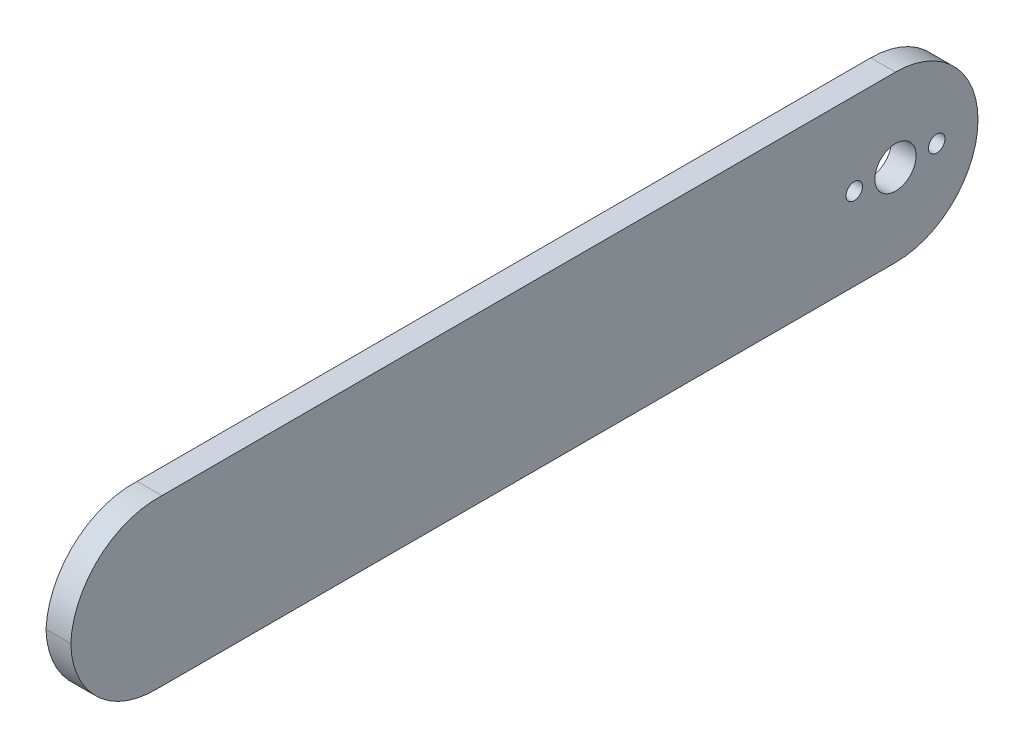
ISO-10303-21;
HEADER;
FILE_DESCRIPTION(('STEP AP214'),'2;1');
FILE_NAME('part.step','',(''),(''),'','','');
FILE_SCHEMA(('AUTOMOTIVE_DESIGN { 1 0 10303 214 1 1 1 1 }'));
ENDSEC;
DATA;
#1=APPLICATION_CONTEXT('core data for automotive mechanical design processes');
#2=APPLICATION_PROTOCOL_DEFINITION('international standard','automotive_design',2000,#1);
#3=PRODUCT_CONTEXT('',#1,'mechanical');
#4=PRODUCT('Part','Part','',(#3));
#5=PRODUCT_RELATED_PRODUCT_CATEGORY('part','',(#4));
#6=PRODUCT_DEFINITION_FORMATION('','',#4);
#7=PRODUCT_DEFINITION_CONTEXT('part definition',#1,'design');
#8=PRODUCT_DEFINITION('design','',#6,#7);
#9=PRODUCT_DEFINITION_SHAPE('','',#8);
#10=(LENGTH_UNIT() NAMED_UNIT(*) SI_UNIT(.MILLI.,.METRE.));
#11=(NAMED_UNIT(*) PLANE_ANGLE_UNIT() SI_UNIT($,.RADIAN.));
#12=(NAMED_UNIT(*) SI_UNIT($,.STERADIAN.) SOLID_ANGLE_UNIT());
#13=UNCERTAINTY_MEASURE_WITH_UNIT(LENGTH_MEASURE(1.E-05),#10,'distance_accuracy_value','');
#14=(GEOMETRIC_REPRESENTATION_CONTEXT(3) GLOBAL_UNCERTAINTY_ASSIGNED_CONTEXT((#13)) GLOBAL_UNIT_ASSIGNED_CONTEXT((#10,
#11,#12)) REPRESENTATION_CONTEXT('',''));
#15=CARTESIAN_POINT('',(0.,0.,0.));
#16=DIRECTION('',(0.,0.,1.));
#17=DIRECTION('',(1.,0.,0.));
#18=AXIS2_PLACEMENT_3D('',#15,#16,#17);
#19=CARTESIAN_POINT('',(3.,-0.696463854515231,82.1611103191617));
#20=DIRECTION('',(-1.,0.,0.));
#21=DIRECTION('',(0.,0.,1.));
#22=AXIS2_PLACEMENT_3D('',#19,#20,#21);
#23=PLANE('',#22);
#24=CARTESIAN_POINT('',(3.,-0.959595959595964,-12.5757575757576));
#25=DIRECTION('',(1.,0.,0.));
#26=DIRECTION('',(0.,0.,-1.));
#27=AXIS2_PLACEMENT_3D('',#24,#25,#26);
#28=CIRCLE('',#27,1.);
#29=CARTESIAN_POINT('',(3.,-0.959595959595964,-13.5757575757576));
#30=VERTEX_POINT('',#29);
#31=EDGE_CURVE('E169',#30,#30,#28,.T.);
#32=ORIENTED_EDGE('',*,*,#31,.F.);
#33=EDGE_LOOP('',(#32));
#34=FACE_BOUND('',#33,.T.);
#35=CARTESIAN_POINT('',(3.,-0.696463854515231,82.1611103191617));
#36=DIRECTION('',(1.,0.,0.));
#37=DIRECTION('',(0.,0.,1.));
#38=AXIS2_PLACEMENT_3D('',#35,#36,#37);
#39=CIRCLE('',#38,10.266504717335);
#40=CARTESIAN_POINT('',(3.,-0.959595959595963,92.4242424242424));
#41=VERTEX_POINT('',#40);
#42=CARTESIAN_POINT('',(3.,-10.959595959596,81.8979782140814));
#43=VERTEX_POINT('',#42);
#44=EDGE_CURVE('E117',#41,#43,#39,.T.);
#45=ORIENTED_EDGE('',*,*,#44,.T.);
#46=DIRECTION('',(0.,0.,-1.));
#47=VECTOR('',#46,1.);
#48=CARTESIAN_POINT('',(3.,-10.959595959596,81.8979782140814));
#49=LINE('',#48,#47);
#50=CARTESIAN_POINT('',(3.,-10.959595959596,-7.57575757575757));
#51=VERTEX_POINT('',#50);
#52=EDGE_CURVE('E84',#43,#51,#49,.T.);
#53=ORIENTED_EDGE('',*,*,#52,.T.);
#54=CARTESIAN_POINT('',(3.,-0.959595959595964,-7.57575757575757));
#55=DIRECTION('',(1.,0.,0.));
#56=DIRECTION('',(0.,0.,-1.));
#57=AXIS2_PLACEMENT_3D('',#54,#55,#56);
#58=CIRCLE('',#57,10.);
#59=CARTESIAN_POINT('',(3.,9.04040404040404,-7.5757575757575));
#60=VERTEX_POINT('',#59);
#61=EDGE_CURVE('E88',#51,#60,#58,.T.);
#62=ORIENTED_EDGE('',*,*,#61,.T.);
#63=DIRECTION('',(0.,0.,1.));
#64=VECTOR('',#63,1.);
#65=CARTESIAN_POINT('',(3.,9.04040404040404,81.3717140039203));
#66=LINE('',#65,#64);
#67=CARTESIAN_POINT('',(3.,9.04040404040404,81.3717140039203));
#68=VERTEX_POINT('',#67);
#69=EDGE_CURVE('E92',#60,#68,#66,.T.);
#70=ORIENTED_EDGE('',*,*,#69,.T.);
#71=CARTESIAN_POINT('',(3.,-1.485860169757,81.8979782140814));
#72=DIRECTION('',(1.,0.,0.));
#73=DIRECTION('',(0.,0.,1.));
#74=AXIS2_PLACEMENT_3D('',#71,#72,#73);
#75=CIRCLE('',#74,10.5394113801964);
#76=EDGE_CURVE('E50',#68,#41,#75,.T.);
#77=ORIENTED_EDGE('',*,*,#76,.T.);
#78=EDGE_LOOP('',(#45,#53,#62,#70,#77));
#79=FACE_BOUND('',#78,.T.);
#80=CARTESIAN_POINT('',(3.,-0.959595959595964,-7.57575757575757));
#81=DIRECTION('',(1.,0.,0.));
#82=DIRECTION('',(0.,0.,-1.));
#83=AXIS2_PLACEMENT_3D('',#80,#81,#82);
#84=CIRCLE('',#83,2.5);
#85=CARTESIAN_POINT('',(3.,-0.959595959595964,-10.0757575757576));
#86=VERTEX_POINT('',#85);
#87=EDGE_CURVE('E111',#86,#86,#84,.T.);
#88=ORIENTED_EDGE('',*,*,#87,.F.);
#89=EDGE_LOOP('',(#88));
#90=FACE_BOUND('',#89,.T.);
#91=CARTESIAN_POINT('',(3.,-0.959595959595964,-2.57575757575757));
#92=DIRECTION('',(1.,0.,0.));
#93=DIRECTION('',(0.,0.,-1.));
#94=AXIS2_PLACEMENT_3D('',#91,#92,#93);
#95=CIRCLE('',#94,1.);
#96=CARTESIAN_POINT('',(3.,-0.959595959595964,-3.57575757575757));
#97=VERTEX_POINT('',#96);
#98=EDGE_CURVE('E160',#97,#97,#95,.T.);
#99=ORIENTED_EDGE('',*,*,#98,.F.);
#100=EDGE_LOOP('',(#99));
#101=FACE_BOUND('',#100,.T.);
#102=ADVANCED_FACE('F33',(#34,#79,#90,#101),#23,.F.);
#103=CARTESIAN_POINT('',(0.,-0.696463854515231,82.1611103191617));
#104=DIRECTION('',(-1.,0.,0.));
#105=DIRECTION('',(0.,0.,1.));
#106=AXIS2_PLACEMENT_3D('',#103,#104,#105);
#107=PLANE('',#106);
#108=CARTESIAN_POINT('',(0.,-0.959595959595964,-12.5757575757576));
#109=DIRECTION('',(1.,0.,0.));
#110=DIRECTION('',(0.,0.,-1.));
#111=AXIS2_PLACEMENT_3D('',#108,#109,#110);
#112=CIRCLE('',#111,1.);
#113=CARTESIAN_POINT('',(0.,-0.959595959595964,-13.5757575757576));
#114=VERTEX_POINT('',#113);
#115=EDGE_CURVE('E166',#114,#114,#112,.T.);
#116=ORIENTED_EDGE('',*,*,#115,.T.);
#117=EDGE_LOOP('',(#116));
#118=FACE_BOUND('',#117,.T.);
#119=CARTESIAN_POINT('',(0.,-0.696463854515231,82.1611103191617));
#120=DIRECTION('',(1.,0.,0.));
#121=DIRECTION('',(0.,0.,1.));
#122=AXIS2_PLACEMENT_3D('',#119,#120,#121);
#123=CIRCLE('',#122,10.266504717335);
#124=CARTESIAN_POINT('',(0.,-0.959595959595963,92.4242424242424));
#125=VERTEX_POINT('',#124);
#126=CARTESIAN_POINT('',(0.,-10.959595959596,81.8979782140814));
#127=VERTEX_POINT('',#126);
#128=EDGE_CURVE('E107',#125,#127,#123,.T.);
#129=ORIENTED_EDGE('',*,*,#128,.F.);
#130=CARTESIAN_POINT('',(0.,-1.485860169757,81.8979782140814));
#131=DIRECTION('',(1.,0.,0.));
#132=DIRECTION('',(0.,0.,1.));
#133=AXIS2_PLACEMENT_3D('',#130,#131,#132);
#134=CIRCLE('',#133,10.5394113801964);
#135=CARTESIAN_POINT('',(0.,9.04040404040404,81.3717140039203));
#136=VERTEX_POINT('',#135);
#137=EDGE_CURVE('E76',#136,#125,#134,.T.);
#138=ORIENTED_EDGE('',*,*,#137,.F.);
#139=DIRECTION('',(0.,0.,1.));
#140=VECTOR('',#139,1.);
#141=CARTESIAN_POINT('',(0.,9.04040404040404,81.3717140039203));
#142=LINE('',#141,#140);
#143=CARTESIAN_POINT('',(0.,9.04040404040404,-7.5757575757575));
#144=VERTEX_POINT('',#143);
#145=EDGE_CURVE('E70',#144,#136,#142,.T.);
#146=ORIENTED_EDGE('',*,*,#145,.F.);
#147=CARTESIAN_POINT('',(0.,-0.959595959595964,-7.57575757575757));
#148=DIRECTION('',(1.,0.,0.));
#149=DIRECTION('',(0.,0.,-1.));
#150=AXIS2_PLACEMENT_3D('',#147,#148,#149);
#151=CIRCLE('',#150,10.);
#152=CARTESIAN_POINT('',(0.,-10.959595959596,-7.57575757575757));
#153=VERTEX_POINT('',#152);
#154=EDGE_CURVE('E98',#153,#144,#151,.T.);
#155=ORIENTED_EDGE('',*,*,#154,.F.);
#156=DIRECTION('',(0.,0.,-1.));
#157=VECTOR('',#156,1.);
#158=CARTESIAN_POINT('',(0.,-10.959595959596,81.8979782140814));
#159=LINE('',#158,#157);
#160=EDGE_CURVE('E110',#127,#153,#159,.T.);
#161=ORIENTED_EDGE('',*,*,#160,.F.);
#162=EDGE_LOOP('',(#129,#138,#146,#155,#161));
#163=FACE_BOUND('',#162,.T.);
#164=CARTESIAN_POINT('',(0.,-0.959595959595964,-7.57575757575757));
#165=DIRECTION('',(1.,0.,0.));
#166=DIRECTION('',(0.,0.,-1.));
#167=AXIS2_PLACEMENT_3D('',#164,#165,#166);
#168=CIRCLE('',#167,2.5);
#169=CARTESIAN_POINT('',(0.,-0.959595959595964,-10.0757575757576));
#170=VERTEX_POINT('',#169);
#171=EDGE_CURVE('E172',#170,#170,#168,.T.);
#172=ORIENTED_EDGE('',*,*,#171,.T.);
#173=EDGE_LOOP('',(#172));
#174=FACE_BOUND('',#173,.T.);
#175=CARTESIAN_POINT('',(0.,-0.959595959595964,-2.57575757575757));
#176=DIRECTION('',(1.,0.,0.));
#177=DIRECTION('',(0.,0.,-1.));
#178=AXIS2_PLACEMENT_3D('',#175,#176,#177);
#179=CIRCLE('',#178,1.);
#180=CARTESIAN_POINT('',(0.,-0.959595959595964,-3.57575757575757));
#181=VERTEX_POINT('',#180);
#182=EDGE_CURVE('E163',#181,#181,#179,.T.);
#183=ORIENTED_EDGE('',*,*,#182,.T.);
#184=EDGE_LOOP('',(#183));
#185=FACE_BOUND('',#184,.T.);
#186=ADVANCED_FACE('F123',(#118,#163,#174,#185),#107,.T.);
#187=CARTESIAN_POINT('',(3.,-0.696463854515231,82.1611103191617));
#188=DIRECTION('',(-1.,0.,0.));
#189=DIRECTION('',(0.,0.,1.));
#190=AXIS2_PLACEMENT_3D('',#187,#188,#189);
#191=CYLINDRICAL_SURFACE('',#190,10.266504717335);
#192=ORIENTED_EDGE('',*,*,#128,.T.);
#193=DIRECTION('',(-1.,0.,0.));
#194=VECTOR('',#193,1.);
#195=CARTESIAN_POINT('',(3.,-10.959595959596,81.8979782140814));
#196=LINE('',#195,#194);
#197=EDGE_CURVE('E11',#43,#127,#196,.T.);
#198=ORIENTED_EDGE('',*,*,#197,.F.);
#199=ORIENTED_EDGE('',*,*,#44,.F.);
#200=DIRECTION('',(-1.,0.,0.));
#201=VECTOR('',#200,1.);
#202=CARTESIAN_POINT('',(3.,-0.959595959595963,92.4242424242424));
#203=LINE('',#202,#201);
#204=EDGE_CURVE('E103',#41,#125,#203,.T.);
#205=ORIENTED_EDGE('',*,*,#204,.T.);
#206=EDGE_LOOP('',(#192,#198,#199,#205));
#207=FACE_BOUND('',#206,.T.);
#208=ADVANCED_FACE('F35',(#207),#191,.T.);
#209=CARTESIAN_POINT('',(3.,-10.959595959596,81.8979782140814));
#210=DIRECTION('',(0.,1.,0.));
#211=DIRECTION('',(0.,0.,1.));
#212=AXIS2_PLACEMENT_3D('',#209,#210,#211);
#213=PLANE('',#212);
#214=ORIENTED_EDGE('',*,*,#160,.T.);
#215=DIRECTION('',(-1.,0.,0.));
#216=VECTOR('',#215,1.);
#217=CARTESIAN_POINT('',(3.,-10.959595959596,-7.57575757575757));
#218=LINE('',#217,#216);
#219=EDGE_CURVE('E42',#51,#153,#218,.T.);
#220=ORIENTED_EDGE('',*,*,#219,.F.);
#221=ORIENTED_EDGE('',*,*,#52,.F.);
#222=ORIENTED_EDGE('',*,*,#197,.T.);
#223=EDGE_LOOP('',(#214,#220,#221,#222));
#224=FACE_BOUND('',#223,.T.);
#225=ADVANCED_FACE('F119',(#224),#213,.F.);
#226=CARTESIAN_POINT('',(3.,-0.959595959595964,-7.57575757575757));
#227=DIRECTION('',(-1.,0.,0.));
#228=DIRECTION('',(0.,0.,1.));
#229=AXIS2_PLACEMENT_3D('',#226,#227,#228);
#230=CYLINDRICAL_SURFACE('',#229,10.);
#231=ORIENTED_EDGE('',*,*,#154,.T.);
#232=DIRECTION('',(-1.,0.,0.));
#233=VECTOR('',#232,1.);
#234=CARTESIAN_POINT('',(3.,9.04040404040404,-7.5757575757575));
#235=LINE('',#234,#233);
#236=EDGE_CURVE('E96',#60,#144,#235,.T.);
#237=ORIENTED_EDGE('',*,*,#236,.F.);
#238=ORIENTED_EDGE('',*,*,#61,.F.);
#239=ORIENTED_EDGE('',*,*,#219,.T.);
#240=EDGE_LOOP('',(#231,#237,#238,#239));
#241=FACE_BOUND('',#240,.T.);
#242=ADVANCED_FACE('F97',(#241),#230,.T.);
#243=CARTESIAN_POINT('',(3.,9.04040404040404,81.3717140039203));
#244=DIRECTION('',(0.,-1.,0.));
#245=DIRECTION('',(0.,0.,-1.));
#246=AXIS2_PLACEMENT_3D('',#243,#244,#245);
#247=PLANE('',#246);
#248=ORIENTED_EDGE('',*,*,#145,.T.);
#249=DIRECTION('',(-1.,0.,0.));
#250=VECTOR('',#249,1.);
#251=CARTESIAN_POINT('',(3.,9.04040404040404,81.3717140039203));
#252=LINE('',#251,#250);
#253=EDGE_CURVE('E99',#68,#136,#252,.T.);
#254=ORIENTED_EDGE('',*,*,#253,.F.);
#255=ORIENTED_EDGE('',*,*,#69,.F.);
#256=ORIENTED_EDGE('',*,*,#236,.T.);
#257=EDGE_LOOP('',(#248,#254,#255,#256));
#258=FACE_BOUND('',#257,.T.);
#259=ADVANCED_FACE('F101',(#258),#247,.F.);
#260=CARTESIAN_POINT('',(3.,-1.485860169757,81.8979782140814));
#261=DIRECTION('',(-1.,0.,0.));
#262=DIRECTION('',(0.,0.,1.));
#263=AXIS2_PLACEMENT_3D('',#260,#261,#262);
#264=CYLINDRICAL_SURFACE('',#263,10.5394113801964);
#265=ORIENTED_EDGE('',*,*,#137,.T.);
#266=ORIENTED_EDGE('',*,*,#204,.F.);
#267=ORIENTED_EDGE('',*,*,#76,.F.);
#268=ORIENTED_EDGE('',*,*,#253,.T.);
#269=EDGE_LOOP('',(#265,#266,#267,#268));
#270=FACE_BOUND('',#269,.T.);
#271=ADVANCED_FACE('F127',(#270),#264,.T.);
#272=CARTESIAN_POINT('',(3.,-0.959595959595964,-7.57575757575757));
#273=DIRECTION('',(-1.,0.,0.));
#274=DIRECTION('',(0.,0.,1.));
#275=AXIS2_PLACEMENT_3D('',#272,#273,#274);
#276=CYLINDRICAL_SURFACE('',#275,2.5);
#277=ORIENTED_EDGE('',*,*,#87,.T.);
#278=EDGE_LOOP('',(#277));
#279=FACE_BOUND('',#278,.T.);
#280=ORIENTED_EDGE('',*,*,#171,.F.);
#281=EDGE_LOOP('',(#280));
#282=FACE_BOUND('',#281,.T.);
#283=ADVANCED_FACE('F129',(#279,#282),#276,.F.);
#284=CARTESIAN_POINT('',(3.,-0.959595959595964,-12.5757575757576));
#285=DIRECTION('',(-1.,0.,0.));
#286=DIRECTION('',(0.,0.,1.));
#287=AXIS2_PLACEMENT_3D('',#284,#285,#286);
#288=CYLINDRICAL_SURFACE('',#287,1.);
#289=ORIENTED_EDGE('',*,*,#31,.T.);
#290=EDGE_LOOP('',(#289));
#291=FACE_BOUND('',#290,.T.);
#292=ORIENTED_EDGE('',*,*,#115,.F.);
#293=EDGE_LOOP('',(#292));
#294=FACE_BOUND('',#293,.T.);
#295=ADVANCED_FACE('F135',(#291,#294),#288,.F.);
#296=CARTESIAN_POINT('',(3.,-0.959595959595964,-2.57575757575757));
#297=DIRECTION('',(-1.,0.,0.));
#298=DIRECTION('',(0.,0.,1.));
#299=AXIS2_PLACEMENT_3D('',#296,#297,#298);
#300=CYLINDRICAL_SURFACE('',#299,1.);
#301=ORIENTED_EDGE('',*,*,#98,.T.);
#302=EDGE_LOOP('',(#301));
#303=FACE_BOUND('',#302,.T.);
#304=ORIENTED_EDGE('',*,*,#182,.F.);
#305=EDGE_LOOP('',(#304));
#306=FACE_BOUND('',#305,.T.);
#307=ADVANCED_FACE('F151',(#303,#306),#300,.F.);
#308=CLOSED_SHELL('',(#102,#186,#208,#225,#242,#259,#271,#283,#295,#307));
#309=MANIFOLD_SOLID_BREP('B2',#308);
#310=ADVANCED_BREP_SHAPE_REPRESENTATION('',(#18,#309),#14);
#311=SHAPE_DEFINITION_REPRESENTATION(#9,#310);
ENDSEC;
END-ISO-10303-21;
